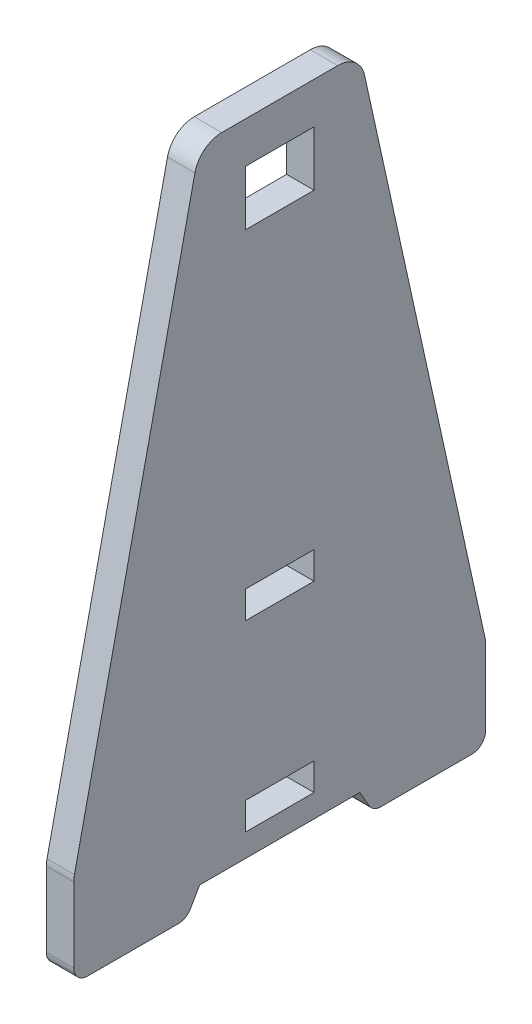
ISO-10303-21;
HEADER;
FILE_DESCRIPTION(('STEP AP214'),'2;1');
FILE_NAME('part.step','',(''),(''),'','','');
FILE_SCHEMA(('AUTOMOTIVE_DESIGN { 1 0 10303 214 1 1 1 1 }'));
ENDSEC;
DATA;
#1=APPLICATION_CONTEXT('core data for automotive mechanical design processes');
#2=APPLICATION_PROTOCOL_DEFINITION('international standard','automotive_design',2000,#1);
#3=PRODUCT_CONTEXT('',#1,'mechanical');
#4=PRODUCT('Part','Part','',(#3));
#5=PRODUCT_RELATED_PRODUCT_CATEGORY('part','',(#4));
#6=PRODUCT_DEFINITION_FORMATION('','',#4);
#7=PRODUCT_DEFINITION_CONTEXT('part definition',#1,'design');
#8=PRODUCT_DEFINITION('design','',#6,#7);
#9=PRODUCT_DEFINITION_SHAPE('','',#8);
#10=(LENGTH_UNIT() NAMED_UNIT(*) SI_UNIT(.MILLI.,.METRE.));
#11=(NAMED_UNIT(*) PLANE_ANGLE_UNIT() SI_UNIT($,.RADIAN.));
#12=(NAMED_UNIT(*) SI_UNIT($,.STERADIAN.) SOLID_ANGLE_UNIT());
#13=UNCERTAINTY_MEASURE_WITH_UNIT(LENGTH_MEASURE(1.E-05),#10,'distance_accuracy_value','');
#14=(GEOMETRIC_REPRESENTATION_CONTEXT(3) GLOBAL_UNCERTAINTY_ASSIGNED_CONTEXT((#13)) GLOBAL_UNIT_ASSIGNED_CONTEXT((#10,
#11,#12)) REPRESENTATION_CONTEXT('',''));
#15=CARTESIAN_POINT('',(0.,0.,0.));
#16=DIRECTION('',(0.,0.,1.));
#17=DIRECTION('',(1.,0.,0.));
#18=AXIS2_PLACEMENT_3D('',#15,#16,#17);
#19=CARTESIAN_POINT('',(6.,5.,17.5));
#20=DIRECTION('',(0.,0.499999999999998,0.86602540378444));
#21=DIRECTION('',(0.,-0.86602540378444,0.499999999999998));
#22=AXIS2_PLACEMENT_3D('',#19,#20,#21);
#23=PLANE('',#22);
#24=DIRECTION('',(0.,0.86602540378444,-0.499999999999997));
#25=VECTOR('',#24,1.);
#26=CARTESIAN_POINT('',(6.,5.,17.5));
#27=LINE('',#26,#25);
#28=CARTESIAN_POINT('',(6.,1.50000000000001,19.5207259421637));
#29=VERTEX_POINT('',#28);
#30=CARTESIAN_POINT('',(6.,5.,17.5));
#31=VERTEX_POINT('',#30);
#32=EDGE_CURVE('E339',#29,#31,#27,.T.);
#33=ORIENTED_EDGE('',*,*,#32,.F.);
#34=DIRECTION('',(-1.,0.,0.));
#35=VECTOR('',#34,1.);
#36=CARTESIAN_POINT('',(6.,1.5,19.5207259421637));
#37=LINE('',#36,#35);
#38=CARTESIAN_POINT('',(0.,1.50000000000001,19.5207259421637));
#39=VERTEX_POINT('',#38);
#40=EDGE_CURVE('E422',#29,#39,#37,.T.);
#41=ORIENTED_EDGE('',*,*,#40,.T.);
#42=DIRECTION('',(0.,0.86602540378444,-0.499999999999997));
#43=VECTOR('',#42,1.);
#44=CARTESIAN_POINT('',(0.,5.,17.5));
#45=LINE('',#44,#43);
#46=CARTESIAN_POINT('',(0.,5.,17.5));
#47=VERTEX_POINT('',#46);
#48=EDGE_CURVE('E272',#39,#47,#45,.T.);
#49=ORIENTED_EDGE('',*,*,#48,.T.);
#50=DIRECTION('',(-1.,0.,0.));
#51=VECTOR('',#50,1.);
#52=CARTESIAN_POINT('',(6.,5.,17.5));
#53=LINE('',#52,#51);
#54=EDGE_CURVE('E392',#31,#47,#53,.T.);
#55=ORIENTED_EDGE('',*,*,#54,.F.);
#56=EDGE_LOOP('',(#33,#41,#49,#55));
#57=FACE_BOUND('',#56,.T.);
#58=ADVANCED_FACE('F33',(#57),#23,.F.);
#59=CARTESIAN_POINT('',(6.,5.,-17.5));
#60=DIRECTION('',(0.,1.,0.));
#61=DIRECTION('',(0.,0.,1.));
#62=AXIS2_PLACEMENT_3D('',#59,#60,#61);
#63=PLANE('',#62);
#64=DIRECTION('',(0.,0.,-1.));
#65=VECTOR('',#64,1.);
#66=CARTESIAN_POINT('',(0.,5.,-17.5));
#67=LINE('',#66,#65);
#68=CARTESIAN_POINT('',(0.,5.,-17.5));
#69=VERTEX_POINT('',#68);
#70=EDGE_CURVE('E367',#47,#69,#67,.T.);
#71=ORIENTED_EDGE('',*,*,#70,.T.);
#72=DIRECTION('',(-1.,0.,0.));
#73=VECTOR('',#72,1.);
#74=CARTESIAN_POINT('',(6.,5.,-17.5));
#75=LINE('',#74,#73);
#76=CARTESIAN_POINT('',(6.,5.,-17.5));
#77=VERTEX_POINT('',#76);
#78=EDGE_CURVE('E365',#77,#69,#75,.T.);
#79=ORIENTED_EDGE('',*,*,#78,.F.);
#80=DIRECTION('',(0.,0.,-1.));
#81=VECTOR('',#80,1.);
#82=CARTESIAN_POINT('',(6.,5.,-17.5));
#83=LINE('',#82,#81);
#84=EDGE_CURVE('E341',#31,#77,#83,.T.);
#85=ORIENTED_EDGE('',*,*,#84,.F.);
#86=ORIENTED_EDGE('',*,*,#54,.T.);
#87=EDGE_LOOP('',(#71,#79,#85,#86));
#88=FACE_BOUND('',#87,.T.);
#89=ADVANCED_FACE('F514',(#88),#63,.F.);
#90=CARTESIAN_POINT('',(6.,5.,-17.5));
#91=DIRECTION('',(0.,0.499999999999998,-0.86602540378444));
#92=DIRECTION('',(0.,0.86602540378444,0.499999999999998));
#93=AXIS2_PLACEMENT_3D('',#90,#91,#92);
#94=PLANE('',#93);
#95=DIRECTION('',(0.,-0.86602540378444,-0.499999999999998));
#96=VECTOR('',#95,1.);
#97=CARTESIAN_POINT('',(0.,5.,-17.5));
#98=LINE('',#97,#96);
#99=CARTESIAN_POINT('',(0.,1.50000000000001,-19.5207259421637));
#100=VERTEX_POINT('',#99);
#101=EDGE_CURVE('E369',#69,#100,#98,.T.);
#102=ORIENTED_EDGE('',*,*,#101,.T.);
#103=DIRECTION('',(-1.,0.,0.));
#104=VECTOR('',#103,1.);
#105=CARTESIAN_POINT('',(6.,1.5,-19.5207259421637));
#106=LINE('',#105,#104);
#107=CARTESIAN_POINT('',(6.,1.50000000000001,-19.5207259421637));
#108=VERTEX_POINT('',#107);
#109=EDGE_CURVE('E420',#100,#108,#106,.F.);
#110=ORIENTED_EDGE('',*,*,#109,.T.);
#111=DIRECTION('',(0.,-0.86602540378444,-0.499999999999998));
#112=VECTOR('',#111,1.);
#113=CARTESIAN_POINT('',(6.,5.,-17.5));
#114=LINE('',#113,#112);
#115=EDGE_CURVE('E344',#77,#108,#114,.T.);
#116=ORIENTED_EDGE('',*,*,#115,.F.);
#117=ORIENTED_EDGE('',*,*,#78,.T.);
#118=EDGE_LOOP('',(#102,#110,#116,#117));
#119=FACE_BOUND('',#118,.T.);
#120=ADVANCED_FACE('F548',(#119),#94,.F.);
#121=CARTESIAN_POINT('',(6.,0.,-20.3867513459481));
#122=DIRECTION('',(0.,1.,0.));
#123=DIRECTION('',(0.,0.,1.));
#124=AXIS2_PLACEMENT_3D('',#121,#122,#123);
#125=PLANE('',#124);
#126=DIRECTION('',(0.,0.,-1.));
#127=VECTOR('',#126,1.);
#128=CARTESIAN_POINT('',(0.,0.,-20.3867513459481));
#129=LINE('',#128,#127);
#130=CARTESIAN_POINT('',(0.,0.,-22.118802153517));
#131=VERTEX_POINT('',#130);
#132=CARTESIAN_POINT('',(0.,0.,-42.));
#133=VERTEX_POINT('',#132);
#134=EDGE_CURVE('E372',#131,#133,#129,.T.);
#135=ORIENTED_EDGE('',*,*,#134,.T.);
#136=DIRECTION('',(-1.,0.,0.));
#137=VECTOR('',#136,1.);
#138=CARTESIAN_POINT('',(6.,0.,-42.));
#139=LINE('',#138,#137);
#140=CARTESIAN_POINT('',(6.,0.,-42.));
#141=VERTEX_POINT('',#140);
#142=EDGE_CURVE('E410',#133,#141,#139,.F.);
#143=ORIENTED_EDGE('',*,*,#142,.T.);
#144=DIRECTION('',(0.,0.,-1.));
#145=VECTOR('',#144,1.);
#146=CARTESIAN_POINT('',(6.,0.,-20.3867513459481));
#147=LINE('',#146,#145);
#148=CARTESIAN_POINT('',(6.,0.,-22.118802153517));
#149=VERTEX_POINT('',#148);
#150=EDGE_CURVE('E347',#149,#141,#147,.T.);
#151=ORIENTED_EDGE('',*,*,#150,.F.);
#152=DIRECTION('',(-1.,0.,0.));
#153=VECTOR('',#152,1.);
#154=CARTESIAN_POINT('',(6.,0.,-22.118802153517));
#155=LINE('',#154,#153);
#156=EDGE_CURVE('E407',#149,#131,#155,.T.);
#157=ORIENTED_EDGE('',*,*,#156,.T.);
#158=EDGE_LOOP('',(#135,#143,#151,#157));
#159=FACE_BOUND('',#158,.T.);
#160=ADVANCED_FACE('F526',(#159),#125,.F.);
#161=CARTESIAN_POINT('',(6.,0.,-45.));
#162=DIRECTION('',(0.,0.,1.));
#163=DIRECTION('',(0.,-1.,0.));
#164=AXIS2_PLACEMENT_3D('',#161,#162,#163);
#165=PLANE('',#164);
#166=DIRECTION('',(0.,1.,0.));
#167=VECTOR('',#166,1.);
#168=CARTESIAN_POINT('',(0.,0.,-45.));
#169=LINE('',#168,#167);
#170=CARTESIAN_POINT('',(0.,3.,-45.));
#171=VERTEX_POINT('',#170);
#172=CARTESIAN_POINT('',(0.,19.3477983938105,-45.));
#173=VERTEX_POINT('',#172);
#174=EDGE_CURVE('E375',#171,#173,#169,.T.);
#175=ORIENTED_EDGE('',*,*,#174,.T.);
#176=DIRECTION('',(-1.,0.,0.));
#177=VECTOR('',#176,1.);
#178=CARTESIAN_POINT('',(6.,19.3477983938105,-45.));
#179=LINE('',#178,#177);
#180=CARTESIAN_POINT('',(6.,19.3477983938105,-45.));
#181=VERTEX_POINT('',#180);
#182=EDGE_CURVE('E11',#173,#181,#179,.F.);
#183=ORIENTED_EDGE('',*,*,#182,.T.);
#184=DIRECTION('',(0.,1.,0.));
#185=VECTOR('',#184,1.);
#186=CARTESIAN_POINT('',(6.,0.,-45.));
#187=LINE('',#186,#185);
#188=CARTESIAN_POINT('',(6.,3.,-45.));
#189=VERTEX_POINT('',#188);
#190=EDGE_CURVE('E350',#189,#181,#187,.T.);
#191=ORIENTED_EDGE('',*,*,#190,.F.);
#192=DIRECTION('',(-1.,0.,0.));
#193=VECTOR('',#192,1.);
#194=CARTESIAN_POINT('',(6.,3.,-45.));
#195=LINE('',#194,#193);
#196=EDGE_CURVE('E395',#189,#171,#195,.T.);
#197=ORIENTED_EDGE('',*,*,#196,.T.);
#198=EDGE_LOOP('',(#175,#183,#191,#197));
#199=FACE_BOUND('',#198,.T.);
#200=ADVANCED_FACE('F536',(#199),#165,.F.);
#201=CARTESIAN_POINT('',(6.,20.,-45.));
#202=DIRECTION('',(0.,-0.21486178267512,0.97664446670509));
#203=DIRECTION('',(0.,-0.97664446670509,-0.21486178267512));
#204=AXIS2_PLACEMENT_3D('',#201,#202,#203);
#205=PLANE('',#204);
#206=DIRECTION('',(0.,0.97664446670509,0.21486178267512));
#207=VECTOR('',#206,1.);
#208=CARTESIAN_POINT('',(0.,20.,-45.));
#209=LINE('',#208,#207);
#210=CARTESIAN_POINT('',(0.,20.6369690898612,-44.8598668002305));
#211=VERTEX_POINT('',#210);
#212=CARTESIAN_POINT('',(0.,140.289170696051,-18.5363824468689));
#213=VERTEX_POINT('',#212);
#214=EDGE_CURVE('E378',#211,#213,#209,.T.);
#215=ORIENTED_EDGE('',*,*,#214,.T.);
#216=DIRECTION('',(-1.,0.,0.));
#217=VECTOR('',#216,1.);
#218=CARTESIAN_POINT('',(6.,140.289170696051,-18.5363824468688));
#219=LINE('',#218,#217);
#220=CARTESIAN_POINT('',(6.,140.289170696051,-18.5363824468689));
#221=VERTEX_POINT('',#220);
#222=EDGE_CURVE('E41',#213,#221,#219,.F.);
#223=ORIENTED_EDGE('',*,*,#222,.T.);
#224=DIRECTION('',(0.,0.97664446670509,0.21486178267512));
#225=VECTOR('',#224,1.);
#226=CARTESIAN_POINT('',(6.,20.,-45.));
#227=LINE('',#226,#225);
#228=CARTESIAN_POINT('',(6.,20.6369690898612,-44.8598668002305));
#229=VERTEX_POINT('',#228);
#230=EDGE_CURVE('E353',#229,#221,#227,.T.);
#231=ORIENTED_EDGE('',*,*,#230,.F.);
#232=DIRECTION('',(-1.,0.,0.));
#233=VECTOR('',#232,1.);
#234=CARTESIAN_POINT('',(6.,20.6369690898612,-44.8598668002305));
#235=LINE('',#234,#233);
#236=EDGE_CURVE('E460',#229,#211,#235,.T.);
#237=ORIENTED_EDGE('',*,*,#236,.T.);
#238=EDGE_LOOP('',(#215,#223,#231,#237));
#239=FACE_BOUND('',#238,.T.);
#240=ADVANCED_FACE('F465',(#239),#205,.F.);
#241=CARTESIAN_POINT('',(6.,145.,17.5));
#242=DIRECTION('',(0.,-1.,0.));
#243=DIRECTION('',(0.,0.,-1.));
#244=AXIS2_PLACEMENT_3D('',#241,#242,#243);
#245=PLANE('',#244);
#246=DIRECTION('',(0.,0.,1.));
#247=VECTOR('',#246,1.);
#248=CARTESIAN_POINT('',(0.,145.,17.5));
#249=LINE('',#248,#247);
#250=CARTESIAN_POINT('',(0.,145.,-12.6765156466383));
#251=VERTEX_POINT('',#250);
#252=CARTESIAN_POINT('',(0.,145.,12.6765156466383));
#253=VERTEX_POINT('',#252);
#254=EDGE_CURVE('E381',#251,#253,#249,.T.);
#255=ORIENTED_EDGE('',*,*,#254,.T.);
#256=DIRECTION('',(-1.,0.,0.));
#257=VECTOR('',#256,1.);
#258=CARTESIAN_POINT('',(6.,145.,12.6765156466383));
#259=LINE('',#258,#257);
#260=CARTESIAN_POINT('',(6.,145.,12.6765156466383));
#261=VERTEX_POINT('',#260);
#262=EDGE_CURVE('E48',#253,#261,#259,.F.);
#263=ORIENTED_EDGE('',*,*,#262,.T.);
#264=DIRECTION('',(0.,0.,1.));
#265=VECTOR('',#264,1.);
#266=CARTESIAN_POINT('',(6.,145.,17.5));
#267=LINE('',#266,#265);
#268=CARTESIAN_POINT('',(6.,145.,-12.6765156466383));
#269=VERTEX_POINT('',#268);
#270=EDGE_CURVE('E355',#269,#261,#267,.T.);
#271=ORIENTED_EDGE('',*,*,#270,.F.);
#272=DIRECTION('',(-1.,0.,0.));
#273=VECTOR('',#272,1.);
#274=CARTESIAN_POINT('',(6.,145.,-12.6765156466383));
#275=LINE('',#274,#273);
#276=EDGE_CURVE('E456',#269,#251,#275,.T.);
#277=ORIENTED_EDGE('',*,*,#276,.T.);
#278=EDGE_LOOP('',(#255,#263,#271,#277));
#279=FACE_BOUND('',#278,.T.);
#280=ADVANCED_FACE('F474',(#279),#245,.F.);
#281=CARTESIAN_POINT('',(6.,20.,45.));
#282=DIRECTION('',(0.,-0.21486178267512,-0.97664446670509));
#283=DIRECTION('',(0.,0.97664446670509,-0.21486178267512));
#284=AXIS2_PLACEMENT_3D('',#281,#282,#283);
#285=PLANE('',#284);
#286=DIRECTION('',(0.,-0.97664446670509,0.21486178267512));
#287=VECTOR('',#286,1.);
#288=CARTESIAN_POINT('',(0.,20.,45.));
#289=LINE('',#288,#287);
#290=CARTESIAN_POINT('',(0.,140.289170696051,18.5363824468689));
#291=VERTEX_POINT('',#290);
#292=CARTESIAN_POINT('',(0.,20.6369690898612,44.8598668002305));
#293=VERTEX_POINT('',#292);
#294=EDGE_CURVE('E383',#291,#293,#289,.T.);
#295=ORIENTED_EDGE('',*,*,#294,.T.);
#296=DIRECTION('',(-1.,0.,0.));
#297=VECTOR('',#296,1.);
#298=CARTESIAN_POINT('',(6.,20.6369690898612,44.8598668002305));
#299=LINE('',#298,#297);
#300=CARTESIAN_POINT('',(6.,20.6369690898612,44.8598668002305));
#301=VERTEX_POINT('',#300);
#302=EDGE_CURVE('E447',#293,#301,#299,.F.);
#303=ORIENTED_EDGE('',*,*,#302,.T.);
#304=DIRECTION('',(0.,-0.97664446670509,0.21486178267512));
#305=VECTOR('',#304,1.);
#306=CARTESIAN_POINT('',(6.,20.,45.));
#307=LINE('',#306,#305);
#308=CARTESIAN_POINT('',(6.,140.289170696051,18.5363824468689));
#309=VERTEX_POINT('',#308);
#310=EDGE_CURVE('E357',#309,#301,#307,.T.);
#311=ORIENTED_EDGE('',*,*,#310,.F.);
#312=DIRECTION('',(-1.,0.,0.));
#313=VECTOR('',#312,1.);
#314=CARTESIAN_POINT('',(6.,140.289170696051,18.5363824468688));
#315=LINE('',#314,#313);
#316=EDGE_CURVE('E444',#309,#291,#315,.T.);
#317=ORIENTED_EDGE('',*,*,#316,.T.);
#318=EDGE_LOOP('',(#295,#303,#311,#317));
#319=FACE_BOUND('',#318,.T.);
#320=ADVANCED_FACE('F484',(#319),#285,.F.);
#321=CARTESIAN_POINT('',(6.,0.,45.));
#322=DIRECTION('',(0.,0.,-1.));
#323=DIRECTION('',(0.,1.,0.));
#324=AXIS2_PLACEMENT_3D('',#321,#322,#323);
#325=PLANE('',#324);
#326=DIRECTION('',(0.,-1.,0.));
#327=VECTOR('',#326,1.);
#328=CARTESIAN_POINT('',(6.,0.,45.));
#329=LINE('',#328,#327);
#330=CARTESIAN_POINT('',(6.,19.3477983938105,45.));
#331=VERTEX_POINT('',#330);
#332=CARTESIAN_POINT('',(6.,3.,45.));
#333=VERTEX_POINT('',#332);
#334=EDGE_CURVE('E360',#331,#333,#329,.T.);
#335=ORIENTED_EDGE('',*,*,#334,.F.);
#336=DIRECTION('',(-1.,0.,0.));
#337=VECTOR('',#336,1.);
#338=CARTESIAN_POINT('',(6.,19.3477983938105,45.));
#339=LINE('',#338,#337);
#340=CARTESIAN_POINT('',(0.,19.3477983938105,45.));
#341=VERTEX_POINT('',#340);
#342=EDGE_CURVE('E433',#331,#341,#339,.T.);
#343=ORIENTED_EDGE('',*,*,#342,.T.);
#344=DIRECTION('',(0.,-1.,0.));
#345=VECTOR('',#344,1.);
#346=CARTESIAN_POINT('',(0.,0.,45.));
#347=LINE('',#346,#345);
#348=CARTESIAN_POINT('',(0.,3.,45.));
#349=VERTEX_POINT('',#348);
#350=EDGE_CURVE('E386',#341,#349,#347,.T.);
#351=ORIENTED_EDGE('',*,*,#350,.T.);
#352=DIRECTION('',(-1.,0.,0.));
#353=VECTOR('',#352,1.);
#354=CARTESIAN_POINT('',(6.,3.,45.));
#355=LINE('',#354,#353);
#356=EDGE_CURVE('E430',#349,#333,#355,.F.);
#357=ORIENTED_EDGE('',*,*,#356,.T.);
#358=EDGE_LOOP('',(#335,#343,#351,#357));
#359=FACE_BOUND('',#358,.T.);
#360=ADVANCED_FACE('F492',(#359),#325,.F.);
#361=CARTESIAN_POINT('',(6.,0.,20.3867513459481));
#362=DIRECTION('',(0.,1.,0.));
#363=DIRECTION('',(0.,0.,1.));
#364=AXIS2_PLACEMENT_3D('',#361,#362,#363);
#365=PLANE('',#364);
#366=DIRECTION('',(0.,0.,-1.));
#367=VECTOR('',#366,1.);
#368=CARTESIAN_POINT('',(0.,0.,20.3867513459481));
#369=LINE('',#368,#367);
#370=CARTESIAN_POINT('',(0.,0.,42.));
#371=VERTEX_POINT('',#370);
#372=CARTESIAN_POINT('',(0.,0.,22.118802153517));
#373=VERTEX_POINT('',#372);
#374=EDGE_CURVE('E342',#371,#373,#369,.T.);
#375=ORIENTED_EDGE('',*,*,#374,.T.);
#376=DIRECTION('',(-1.,0.,0.));
#377=VECTOR('',#376,1.);
#378=CARTESIAN_POINT('',(6.,0.,22.118802153517));
#379=LINE('',#378,#377);
#380=CARTESIAN_POINT('',(6.,0.,22.118802153517));
#381=VERTEX_POINT('',#380);
#382=EDGE_CURVE('E428',#373,#381,#379,.F.);
#383=ORIENTED_EDGE('',*,*,#382,.T.);
#384=DIRECTION('',(0.,0.,-1.));
#385=VECTOR('',#384,1.);
#386=CARTESIAN_POINT('',(6.,0.,20.3867513459481));
#387=LINE('',#386,#385);
#388=CARTESIAN_POINT('',(6.,0.,42.));
#389=VERTEX_POINT('',#388);
#390=EDGE_CURVE('E362',#389,#381,#387,.T.);
#391=ORIENTED_EDGE('',*,*,#390,.F.);
#392=DIRECTION('',(-1.,0.,0.));
#393=VECTOR('',#392,1.);
#394=CARTESIAN_POINT('',(6.,0.,42.));
#395=LINE('',#394,#393);
#396=EDGE_CURVE('E425',#389,#371,#395,.T.);
#397=ORIENTED_EDGE('',*,*,#396,.T.);
#398=EDGE_LOOP('',(#375,#383,#391,#397));
#399=FACE_BOUND('',#398,.T.);
#400=ADVANCED_FACE('F502',(#399),#365,.F.);
#401=CARTESIAN_POINT('',(6.,0.,0.));
#402=DIRECTION('',(-1.,0.,0.));
#403=DIRECTION('',(0.,0.,1.));
#404=AXIS2_PLACEMENT_3D('',#401,#402,#403);
#405=PLANE('',#404);
#406=DIRECTION('',(0.,0.,-1.));
#407=VECTOR('',#406,1.);
#408=CARTESIAN_POINT('',(6.,124.,-7.49999999999997));
#409=LINE('',#408,#407);
#410=CARTESIAN_POINT('',(6.,124.,7.50000000000002));
#411=VERTEX_POINT('',#410);
#412=CARTESIAN_POINT('',(6.,124.,-7.49999999999997));
#413=VERTEX_POINT('',#412);
#414=EDGE_CURVE('E265',#411,#413,#409,.T.);
#415=ORIENTED_EDGE('',*,*,#414,.F.);
#416=DIRECTION('',(0.,-1.,0.));
#417=VECTOR('',#416,1.);
#418=CARTESIAN_POINT('',(6.,136.,7.50000000000003));
#419=LINE('',#418,#417);
#420=CARTESIAN_POINT('',(6.,136.,7.50000000000003));
#421=VERTEX_POINT('',#420);
#422=EDGE_CURVE('E238',#421,#411,#419,.T.);
#423=ORIENTED_EDGE('',*,*,#422,.F.);
#424=DIRECTION('',(0.,0.,1.));
#425=VECTOR('',#424,1.);
#426=CARTESIAN_POINT('',(6.,136.,-7.49999999999997));
#427=LINE('',#426,#425);
#428=CARTESIAN_POINT('',(6.,136.,-7.49999999999997));
#429=VERTEX_POINT('',#428);
#430=EDGE_CURVE('E256',#429,#421,#427,.T.);
#431=ORIENTED_EDGE('',*,*,#430,.F.);
#432=DIRECTION('',(0.,1.,0.));
#433=VECTOR('',#432,1.);
#434=CARTESIAN_POINT('',(6.,136.,-7.49999999999997));
#435=LINE('',#434,#433);
#436=EDGE_CURVE('E259',#413,#429,#435,.T.);
#437=ORIENTED_EDGE('',*,*,#436,.F.);
#438=EDGE_LOOP('',(#415,#423,#431,#437));
#439=FACE_BOUND('',#438,.T.);
#440=DIRECTION('',(0.,0.,-1.));
#441=VECTOR('',#440,1.);
#442=CARTESIAN_POINT('',(6.,50.,-7.5));
#443=LINE('',#442,#441);
#444=CARTESIAN_POINT('',(6.,50.,7.5));
#445=VERTEX_POINT('',#444);
#446=CARTESIAN_POINT('',(6.,50.,-7.5));
#447=VERTEX_POINT('',#446);
#448=EDGE_CURVE('E292',#445,#447,#443,.T.);
#449=ORIENTED_EDGE('',*,*,#448,.F.);
#450=DIRECTION('',(0.,-1.,0.));
#451=VECTOR('',#450,1.);
#452=CARTESIAN_POINT('',(6.,56.,7.5));
#453=LINE('',#452,#451);
#454=CARTESIAN_POINT('',(6.,56.,7.5));
#455=VERTEX_POINT('',#454);
#456=EDGE_CURVE('E290',#455,#445,#453,.T.);
#457=ORIENTED_EDGE('',*,*,#456,.F.);
#458=DIRECTION('',(0.,0.,1.));
#459=VECTOR('',#458,1.);
#460=CARTESIAN_POINT('',(6.,56.,-7.5));
#461=LINE('',#460,#459);
#462=CARTESIAN_POINT('',(6.,56.,-7.5));
#463=VERTEX_POINT('',#462);
#464=EDGE_CURVE('E280',#463,#455,#461,.T.);
#465=ORIENTED_EDGE('',*,*,#464,.F.);
#466=DIRECTION('',(0.,1.,0.));
#467=VECTOR('',#466,1.);
#468=CARTESIAN_POINT('',(6.,56.,-7.5));
#469=LINE('',#468,#467);
#470=EDGE_CURVE('E296',#447,#463,#469,.T.);
#471=ORIENTED_EDGE('',*,*,#470,.F.);
#472=EDGE_LOOP('',(#449,#457,#465,#471));
#473=FACE_BOUND('',#472,.T.);
#474=DIRECTION('',(0.,0.,-1.));
#475=VECTOR('',#474,1.);
#476=CARTESIAN_POINT('',(6.,10.,-7.5));
#477=LINE('',#476,#475);
#478=CARTESIAN_POINT('',(6.,10.,7.5));
#479=VERTEX_POINT('',#478);
#480=CARTESIAN_POINT('',(6.,10.,-7.5));
#481=VERTEX_POINT('',#480);
#482=EDGE_CURVE('E324',#479,#481,#477,.T.);
#483=ORIENTED_EDGE('',*,*,#482,.F.);
#484=DIRECTION('',(0.,-1.,0.));
#485=VECTOR('',#484,1.);
#486=CARTESIAN_POINT('',(6.,16.,7.5));
#487=LINE('',#486,#485);
#488=CARTESIAN_POINT('',(6.,16.,7.5));
#489=VERTEX_POINT('',#488);
#490=EDGE_CURVE('E322',#489,#479,#487,.T.);
#491=ORIENTED_EDGE('',*,*,#490,.F.);
#492=DIRECTION('',(0.,0.,1.));
#493=VECTOR('',#492,1.);
#494=CARTESIAN_POINT('',(6.,16.,-7.5));
#495=LINE('',#494,#493);
#496=CARTESIAN_POINT('',(6.,16.,-7.5));
#497=VERTEX_POINT('',#496);
#498=EDGE_CURVE('E312',#497,#489,#495,.T.);
#499=ORIENTED_EDGE('',*,*,#498,.F.);
#500=DIRECTION('',(0.,1.,0.));
#501=VECTOR('',#500,1.);
#502=CARTESIAN_POINT('',(6.,16.,-7.5));
#503=LINE('',#502,#501);
#504=EDGE_CURVE('E327',#481,#497,#503,.T.);
#505=ORIENTED_EDGE('',*,*,#504,.F.);
#506=EDGE_LOOP('',(#483,#491,#499,#505));
#507=FACE_BOUND('',#506,.T.);
#508=ORIENTED_EDGE('',*,*,#310,.T.);
#509=CARTESIAN_POINT('',(6.,19.3477983938105,39.));
#510=DIRECTION('',(-1.,0.,0.));
#511=DIRECTION('',(0.,0.,1.));
#512=AXIS2_PLACEMENT_3D('',#509,#510,#511);
#513=CIRCLE('',#512,6.);
#514=EDGE_CURVE('E454',#301,#331,#513,.F.);
#515=ORIENTED_EDGE('',*,*,#514,.T.);
#516=ORIENTED_EDGE('',*,*,#334,.T.);
#517=CARTESIAN_POINT('',(6.,3.,42.));
#518=DIRECTION('',(-1.,0.,0.));
#519=DIRECTION('',(0.,0.,1.));
#520=AXIS2_PLACEMENT_3D('',#517,#518,#519);
#521=CIRCLE('',#520,3.);
#522=EDGE_CURVE('E412',#333,#389,#521,.F.);
#523=ORIENTED_EDGE('',*,*,#522,.T.);
#524=ORIENTED_EDGE('',*,*,#390,.T.);
#525=CARTESIAN_POINT('',(6.,3.,22.118802153517));
#526=DIRECTION('',(-1.,0.,0.));
#527=DIRECTION('',(0.,0.,1.));
#528=AXIS2_PLACEMENT_3D('',#525,#526,#527);
#529=CIRCLE('',#528,3.);
#530=EDGE_CURVE('E414',#381,#29,#529,.F.);
#531=ORIENTED_EDGE('',*,*,#530,.T.);
#532=ORIENTED_EDGE('',*,*,#32,.T.);
#533=ORIENTED_EDGE('',*,*,#84,.T.);
#534=ORIENTED_EDGE('',*,*,#115,.T.);
#535=CARTESIAN_POINT('',(6.,3.,-22.118802153517));
#536=DIRECTION('',(-1.,0.,0.));
#537=DIRECTION('',(0.,0.,1.));
#538=AXIS2_PLACEMENT_3D('',#535,#536,#537);
#539=CIRCLE('',#538,3.);
#540=EDGE_CURVE('E416',#108,#149,#539,.F.);
#541=ORIENTED_EDGE('',*,*,#540,.T.);
#542=ORIENTED_EDGE('',*,*,#150,.T.);
#543=CARTESIAN_POINT('',(6.,3.,-42.));
#544=DIRECTION('',(-1.,0.,0.));
#545=DIRECTION('',(0.,0.,1.));
#546=AXIS2_PLACEMENT_3D('',#543,#544,#545);
#547=CIRCLE('',#546,3.);
#548=EDGE_CURVE('E418',#141,#189,#547,.F.);
#549=ORIENTED_EDGE('',*,*,#548,.T.);
#550=ORIENTED_EDGE('',*,*,#190,.T.);
#551=CARTESIAN_POINT('',(6.,19.3477983938105,-39.));
#552=DIRECTION('',(-1.,0.,0.));
#553=DIRECTION('',(0.,0.,1.));
#554=AXIS2_PLACEMENT_3D('',#551,#552,#553);
#555=CIRCLE('',#554,6.);
#556=EDGE_CURVE('E449',#181,#229,#555,.F.);
#557=ORIENTED_EDGE('',*,*,#556,.T.);
#558=ORIENTED_EDGE('',*,*,#230,.T.);
#559=CARTESIAN_POINT('',(6.,139.,-12.6765156466383));
#560=DIRECTION('',(-1.,0.,0.));
#561=DIRECTION('',(0.,0.,1.));
#562=AXIS2_PLACEMENT_3D('',#559,#560,#561);
#563=CIRCLE('',#562,6.);
#564=EDGE_CURVE('E55',#221,#269,#563,.F.);
#565=ORIENTED_EDGE('',*,*,#564,.T.);
#566=ORIENTED_EDGE('',*,*,#270,.T.);
#567=CARTESIAN_POINT('',(6.,139.,12.6765156466383));
#568=DIRECTION('',(-1.,0.,0.));
#569=DIRECTION('',(0.,0.,1.));
#570=AXIS2_PLACEMENT_3D('',#567,#568,#569);
#571=CIRCLE('',#570,6.);
#572=EDGE_CURVE('E452',#261,#309,#571,.F.);
#573=ORIENTED_EDGE('',*,*,#572,.T.);
#574=EDGE_LOOP('',(#508,#515,#516,#523,#524,#531,#532,#533,#534,#541,#542,#549,#550,#557,#558,
#565,#566,#573));
#575=FACE_BOUND('',#574,.T.);
#576=ADVANCED_FACE('F469',(#439,#473,#507,#575),#405,.F.);
#577=CARTESIAN_POINT('',(0.,0.,0.));
#578=DIRECTION('',(-1.,0.,0.));
#579=DIRECTION('',(0.,0.,1.));
#580=AXIS2_PLACEMENT_3D('',#577,#578,#579);
#581=PLANE('',#580);
#582=DIRECTION('',(0.,-1.,0.));
#583=VECTOR('',#582,1.);
#584=CARTESIAN_POINT('',(0.,136.,7.50000000000003));
#585=LINE('',#584,#583);
#586=CARTESIAN_POINT('',(0.,136.,7.50000000000003));
#587=VERTEX_POINT('',#586);
#588=CARTESIAN_POINT('',(0.,124.,7.50000000000002));
#589=VERTEX_POINT('',#588);
#590=EDGE_CURVE('E235',#587,#589,#585,.T.);
#591=ORIENTED_EDGE('',*,*,#590,.T.);
#592=DIRECTION('',(0.,0.,-1.));
#593=VECTOR('',#592,1.);
#594=CARTESIAN_POINT('',(0.,124.,-7.49999999999997));
#595=LINE('',#594,#593);
#596=CARTESIAN_POINT('',(0.,124.,-7.49999999999997));
#597=VERTEX_POINT('',#596);
#598=EDGE_CURVE('E247',#589,#597,#595,.T.);
#599=ORIENTED_EDGE('',*,*,#598,.T.);
#600=DIRECTION('',(0.,1.,0.));
#601=VECTOR('',#600,1.);
#602=CARTESIAN_POINT('',(0.,136.,-7.49999999999997));
#603=LINE('',#602,#601);
#604=CARTESIAN_POINT('',(0.,136.,-7.49999999999997));
#605=VERTEX_POINT('',#604);
#606=EDGE_CURVE('E251',#597,#605,#603,.T.);
#607=ORIENTED_EDGE('',*,*,#606,.T.);
#608=DIRECTION('',(0.,0.,1.));
#609=VECTOR('',#608,1.);
#610=CARTESIAN_POINT('',(0.,136.,-7.49999999999997));
#611=LINE('',#610,#609);
#612=EDGE_CURVE('E243',#605,#587,#611,.T.);
#613=ORIENTED_EDGE('',*,*,#612,.T.);
#614=EDGE_LOOP('',(#591,#599,#607,#613));
#615=FACE_BOUND('',#614,.T.);
#616=DIRECTION('',(0.,-1.,0.));
#617=VECTOR('',#616,1.);
#618=CARTESIAN_POINT('',(0.,56.,7.5));
#619=LINE('',#618,#617);
#620=CARTESIAN_POINT('',(0.,56.,7.5));
#621=VERTEX_POINT('',#620);
#622=CARTESIAN_POINT('',(0.,50.,7.5));
#623=VERTEX_POINT('',#622);
#624=EDGE_CURVE('E276',#621,#623,#619,.T.);
#625=ORIENTED_EDGE('',*,*,#624,.T.);
#626=DIRECTION('',(0.,0.,-1.));
#627=VECTOR('',#626,1.);
#628=CARTESIAN_POINT('',(0.,50.,-7.5));
#629=LINE('',#628,#627);
#630=CARTESIAN_POINT('',(0.,50.,-7.5));
#631=VERTEX_POINT('',#630);
#632=EDGE_CURVE('E279',#623,#631,#629,.T.);
#633=ORIENTED_EDGE('',*,*,#632,.T.);
#634=DIRECTION('',(0.,1.,0.));
#635=VECTOR('',#634,1.);
#636=CARTESIAN_POINT('',(0.,56.,-7.5));
#637=LINE('',#636,#635);
#638=CARTESIAN_POINT('',(0.,56.,-7.5));
#639=VERTEX_POINT('',#638);
#640=EDGE_CURVE('E283',#631,#639,#637,.T.);
#641=ORIENTED_EDGE('',*,*,#640,.T.);
#642=DIRECTION('',(0.,0.,1.));
#643=VECTOR('',#642,1.);
#644=CARTESIAN_POINT('',(0.,56.,-7.5));
#645=LINE('',#644,#643);
#646=EDGE_CURVE('E286',#639,#621,#645,.T.);
#647=ORIENTED_EDGE('',*,*,#646,.T.);
#648=EDGE_LOOP('',(#625,#633,#641,#647));
#649=FACE_BOUND('',#648,.T.);
#650=DIRECTION('',(0.,-1.,0.));
#651=VECTOR('',#650,1.);
#652=CARTESIAN_POINT('',(0.,16.,7.5));
#653=LINE('',#652,#651);
#654=CARTESIAN_POINT('',(0.,16.,7.5));
#655=VERTEX_POINT('',#654);
#656=CARTESIAN_POINT('',(0.,10.,7.5));
#657=VERTEX_POINT('',#656);
#658=EDGE_CURVE('E308',#655,#657,#653,.T.);
#659=ORIENTED_EDGE('',*,*,#658,.T.);
#660=DIRECTION('',(0.,0.,-1.));
#661=VECTOR('',#660,1.);
#662=CARTESIAN_POINT('',(0.,10.,-7.5));
#663=LINE('',#662,#661);
#664=CARTESIAN_POINT('',(0.,10.,-7.5));
#665=VERTEX_POINT('',#664);
#666=EDGE_CURVE('E311',#657,#665,#663,.T.);
#667=ORIENTED_EDGE('',*,*,#666,.T.);
#668=DIRECTION('',(0.,1.,0.));
#669=VECTOR('',#668,1.);
#670=CARTESIAN_POINT('',(0.,16.,-7.5));
#671=LINE('',#670,#669);
#672=CARTESIAN_POINT('',(0.,16.,-7.5));
#673=VERTEX_POINT('',#672);
#674=EDGE_CURVE('E315',#665,#673,#671,.T.);
#675=ORIENTED_EDGE('',*,*,#674,.T.);
#676=DIRECTION('',(0.,0.,1.));
#677=VECTOR('',#676,1.);
#678=CARTESIAN_POINT('',(0.,16.,-7.5));
#679=LINE('',#678,#677);
#680=EDGE_CURVE('E318',#673,#655,#679,.T.);
#681=ORIENTED_EDGE('',*,*,#680,.T.);
#682=EDGE_LOOP('',(#659,#667,#675,#681));
#683=FACE_BOUND('',#682,.T.);
#684=ORIENTED_EDGE('',*,*,#350,.F.);
#685=CARTESIAN_POINT('',(0.,19.3477983938105,39.));
#686=DIRECTION('',(-1.,0.,0.));
#687=DIRECTION('',(0.,0.,1.));
#688=AXIS2_PLACEMENT_3D('',#685,#686,#687);
#689=CIRCLE('',#688,6.);
#690=EDGE_CURVE('E442',#341,#293,#689,.T.);
#691=ORIENTED_EDGE('',*,*,#690,.T.);
#692=ORIENTED_EDGE('',*,*,#294,.F.);
#693=CARTESIAN_POINT('',(0.,139.,12.6765156466383));
#694=DIRECTION('',(-1.,0.,0.));
#695=DIRECTION('',(0.,0.,1.));
#696=AXIS2_PLACEMENT_3D('',#693,#694,#695);
#697=CIRCLE('',#696,6.);
#698=EDGE_CURVE('E440',#291,#253,#697,.T.);
#699=ORIENTED_EDGE('',*,*,#698,.T.);
#700=ORIENTED_EDGE('',*,*,#254,.F.);
#701=CARTESIAN_POINT('',(0.,139.,-12.6765156466383));
#702=DIRECTION('',(-1.,0.,0.));
#703=DIRECTION('',(0.,0.,1.));
#704=AXIS2_PLACEMENT_3D('',#701,#702,#703);
#705=CIRCLE('',#704,6.);
#706=EDGE_CURVE('E438',#251,#213,#705,.T.);
#707=ORIENTED_EDGE('',*,*,#706,.T.);
#708=ORIENTED_EDGE('',*,*,#214,.F.);
#709=CARTESIAN_POINT('',(0.,19.3477983938105,-39.));
#710=DIRECTION('',(-1.,0.,0.));
#711=DIRECTION('',(0.,0.,1.));
#712=AXIS2_PLACEMENT_3D('',#709,#710,#711);
#713=CIRCLE('',#712,6.);
#714=EDGE_CURVE('E436',#211,#173,#713,.T.);
#715=ORIENTED_EDGE('',*,*,#714,.T.);
#716=ORIENTED_EDGE('',*,*,#174,.F.);
#717=CARTESIAN_POINT('',(0.,3.,-42.));
#718=DIRECTION('',(-1.,0.,0.));
#719=DIRECTION('',(0.,0.,1.));
#720=AXIS2_PLACEMENT_3D('',#717,#718,#719);
#721=CIRCLE('',#720,3.);
#722=EDGE_CURVE('E405',#171,#133,#721,.T.);
#723=ORIENTED_EDGE('',*,*,#722,.T.);
#724=ORIENTED_EDGE('',*,*,#134,.F.);
#725=CARTESIAN_POINT('',(0.,3.,-22.118802153517));
#726=DIRECTION('',(-1.,0.,0.));
#727=DIRECTION('',(0.,0.,1.));
#728=AXIS2_PLACEMENT_3D('',#725,#726,#727);
#729=CIRCLE('',#728,3.);
#730=EDGE_CURVE('E403',#131,#100,#729,.T.);
#731=ORIENTED_EDGE('',*,*,#730,.T.);
#732=ORIENTED_EDGE('',*,*,#101,.F.);
#733=ORIENTED_EDGE('',*,*,#70,.F.);
#734=ORIENTED_EDGE('',*,*,#48,.F.);
#735=CARTESIAN_POINT('',(0.,3.,22.118802153517));
#736=DIRECTION('',(-1.,0.,0.));
#737=DIRECTION('',(0.,0.,1.));
#738=AXIS2_PLACEMENT_3D('',#735,#736,#737);
#739=CIRCLE('',#738,3.);
#740=EDGE_CURVE('E401',#39,#373,#739,.T.);
#741=ORIENTED_EDGE('',*,*,#740,.T.);
#742=ORIENTED_EDGE('',*,*,#374,.F.);
#743=CARTESIAN_POINT('',(0.,3.,42.));
#744=DIRECTION('',(-1.,0.,0.));
#745=DIRECTION('',(0.,0.,1.));
#746=AXIS2_PLACEMENT_3D('',#743,#744,#745);
#747=CIRCLE('',#746,3.);
#748=EDGE_CURVE('E398',#371,#349,#747,.T.);
#749=ORIENTED_EDGE('',*,*,#748,.T.);
#750=EDGE_LOOP('',(#684,#691,#692,#699,#700,#707,#708,#715,#716,#723,#724,#731,#732,#733,#734,
#741,#742,#749));
#751=FACE_BOUND('',#750,.T.);
#752=ADVANCED_FACE('F253',(#615,#649,#683,#751),#581,.T.);
#753=CARTESIAN_POINT('',(0.,16.,7.5));
#754=DIRECTION('',(0.,0.,1.));
#755=DIRECTION('',(0.,-1.,0.));
#756=AXIS2_PLACEMENT_3D('',#753,#754,#755);
#757=PLANE('',#756);
#758=ORIENTED_EDGE('',*,*,#490,.T.);
#759=DIRECTION('',(1.,0.,0.));
#760=VECTOR('',#759,1.);
#761=CARTESIAN_POINT('',(0.,10.,7.5));
#762=LINE('',#761,#760);
#763=EDGE_CURVE('E321',#657,#479,#762,.T.);
#764=ORIENTED_EDGE('',*,*,#763,.F.);
#765=ORIENTED_EDGE('',*,*,#658,.F.);
#766=DIRECTION('',(1.,0.,0.));
#767=VECTOR('',#766,1.);
#768=CARTESIAN_POINT('',(0.,16.,7.5));
#769=LINE('',#768,#767);
#770=EDGE_CURVE('E293',#655,#489,#769,.T.);
#771=ORIENTED_EDGE('',*,*,#770,.T.);
#772=EDGE_LOOP('',(#758,#764,#765,#771));
#773=FACE_BOUND('',#772,.T.);
#774=ADVANCED_FACE('F701',(#773),#757,.F.);
#775=CARTESIAN_POINT('',(0.,16.,-7.5));
#776=DIRECTION('',(0.,1.,0.));
#777=DIRECTION('',(0.,0.,1.));
#778=AXIS2_PLACEMENT_3D('',#775,#776,#777);
#779=PLANE('',#778);
#780=ORIENTED_EDGE('',*,*,#498,.T.);
#781=ORIENTED_EDGE('',*,*,#770,.F.);
#782=ORIENTED_EDGE('',*,*,#680,.F.);
#783=DIRECTION('',(1.,0.,0.));
#784=VECTOR('',#783,1.);
#785=CARTESIAN_POINT('',(0.,16.,-7.5));
#786=LINE('',#785,#784);
#787=EDGE_CURVE('E333',#673,#497,#786,.T.);
#788=ORIENTED_EDGE('',*,*,#787,.T.);
#789=EDGE_LOOP('',(#780,#781,#782,#788));
#790=FACE_BOUND('',#789,.T.);
#791=ADVANCED_FACE('F692',(#790),#779,.F.);
#792=CARTESIAN_POINT('',(0.,16.,-7.5));
#793=DIRECTION('',(0.,0.,-1.));
#794=DIRECTION('',(0.,1.,0.));
#795=AXIS2_PLACEMENT_3D('',#792,#793,#794);
#796=PLANE('',#795);
#797=ORIENTED_EDGE('',*,*,#504,.T.);
#798=ORIENTED_EDGE('',*,*,#787,.F.);
#799=ORIENTED_EDGE('',*,*,#674,.F.);
#800=DIRECTION('',(1.,0.,0.));
#801=VECTOR('',#800,1.);
#802=CARTESIAN_POINT('',(0.,10.,-7.5));
#803=LINE('',#802,#801);
#804=EDGE_CURVE('E335',#665,#481,#803,.T.);
#805=ORIENTED_EDGE('',*,*,#804,.T.);
#806=EDGE_LOOP('',(#797,#798,#799,#805));
#807=FACE_BOUND('',#806,.T.);
#808=ADVANCED_FACE('F683',(#807),#796,.F.);
#809=CARTESIAN_POINT('',(0.,10.,-7.5));
#810=DIRECTION('',(0.,-1.,0.));
#811=DIRECTION('',(0.,0.,-1.));
#812=AXIS2_PLACEMENT_3D('',#809,#810,#811);
#813=PLANE('',#812);
#814=ORIENTED_EDGE('',*,*,#482,.T.);
#815=ORIENTED_EDGE('',*,*,#804,.F.);
#816=ORIENTED_EDGE('',*,*,#666,.F.);
#817=ORIENTED_EDGE('',*,*,#763,.T.);
#818=EDGE_LOOP('',(#814,#815,#816,#817));
#819=FACE_BOUND('',#818,.T.);
#820=ADVANCED_FACE('F674',(#819),#813,.F.);
#821=CARTESIAN_POINT('',(0.,56.,7.5));
#822=DIRECTION('',(0.,0.,1.));
#823=DIRECTION('',(0.,-1.,0.));
#824=AXIS2_PLACEMENT_3D('',#821,#822,#823);
#825=PLANE('',#824);
#826=ORIENTED_EDGE('',*,*,#456,.T.);
#827=DIRECTION('',(1.,0.,0.));
#828=VECTOR('',#827,1.);
#829=CARTESIAN_POINT('',(0.,50.,7.5));
#830=LINE('',#829,#828);
#831=EDGE_CURVE('E289',#623,#445,#830,.T.);
#832=ORIENTED_EDGE('',*,*,#831,.F.);
#833=ORIENTED_EDGE('',*,*,#624,.F.);
#834=DIRECTION('',(1.,0.,0.));
#835=VECTOR('',#834,1.);
#836=CARTESIAN_POINT('',(0.,56.,7.5));
#837=LINE('',#836,#835);
#838=EDGE_CURVE('E266',#621,#455,#837,.T.);
#839=ORIENTED_EDGE('',*,*,#838,.T.);
#840=EDGE_LOOP('',(#826,#832,#833,#839));
#841=FACE_BOUND('',#840,.T.);
#842=ADVANCED_FACE('F665',(#841),#825,.F.);
#843=CARTESIAN_POINT('',(0.,56.,-7.5));
#844=DIRECTION('',(0.,1.,0.));
#845=DIRECTION('',(0.,0.,1.));
#846=AXIS2_PLACEMENT_3D('',#843,#844,#845);
#847=PLANE('',#846);
#848=ORIENTED_EDGE('',*,*,#464,.T.);
#849=ORIENTED_EDGE('',*,*,#838,.F.);
#850=ORIENTED_EDGE('',*,*,#646,.F.);
#851=DIRECTION('',(1.,0.,0.));
#852=VECTOR('',#851,1.);
#853=CARTESIAN_POINT('',(0.,56.,-7.5));
#854=LINE('',#853,#852);
#855=EDGE_CURVE('E302',#639,#463,#854,.T.);
#856=ORIENTED_EDGE('',*,*,#855,.T.);
#857=EDGE_LOOP('',(#848,#849,#850,#856));
#858=FACE_BOUND('',#857,.T.);
#859=ADVANCED_FACE('F656',(#858),#847,.F.);
#860=CARTESIAN_POINT('',(0.,56.,-7.5));
#861=DIRECTION('',(0.,0.,-1.));
#862=DIRECTION('',(0.,1.,0.));
#863=AXIS2_PLACEMENT_3D('',#860,#861,#862);
#864=PLANE('',#863);
#865=ORIENTED_EDGE('',*,*,#470,.T.);
#866=ORIENTED_EDGE('',*,*,#855,.F.);
#867=ORIENTED_EDGE('',*,*,#640,.F.);
#868=DIRECTION('',(1.,0.,0.));
#869=VECTOR('',#868,1.);
#870=CARTESIAN_POINT('',(0.,50.,-7.5));
#871=LINE('',#870,#869);
#872=EDGE_CURVE('E304',#631,#447,#871,.T.);
#873=ORIENTED_EDGE('',*,*,#872,.T.);
#874=EDGE_LOOP('',(#865,#866,#867,#873));
#875=FACE_BOUND('',#874,.T.);
#876=ADVANCED_FACE('F647',(#875),#864,.F.);
#877=CARTESIAN_POINT('',(0.,50.,-7.5));
#878=DIRECTION('',(0.,-1.,0.));
#879=DIRECTION('',(0.,0.,-1.));
#880=AXIS2_PLACEMENT_3D('',#877,#878,#879);
#881=PLANE('',#880);
#882=ORIENTED_EDGE('',*,*,#448,.T.);
#883=ORIENTED_EDGE('',*,*,#872,.F.);
#884=ORIENTED_EDGE('',*,*,#632,.F.);
#885=ORIENTED_EDGE('',*,*,#831,.T.);
#886=EDGE_LOOP('',(#882,#883,#884,#885));
#887=FACE_BOUND('',#886,.T.);
#888=ADVANCED_FACE('F639',(#887),#881,.F.);
#889=CARTESIAN_POINT('',(0.,136.,7.50000000000003));
#890=DIRECTION('',(0.,0.,1.));
#891=DIRECTION('',(0.,-1.,0.));
#892=AXIS2_PLACEMENT_3D('',#889,#890,#891);
#893=PLANE('',#892);
#894=ORIENTED_EDGE('',*,*,#422,.T.);
#895=DIRECTION('',(1.,0.,0.));
#896=VECTOR('',#895,1.);
#897=CARTESIAN_POINT('',(0.,124.,7.50000000000002));
#898=LINE('',#897,#896);
#899=EDGE_CURVE('E231',#589,#411,#898,.T.);
#900=ORIENTED_EDGE('',*,*,#899,.F.);
#901=ORIENTED_EDGE('',*,*,#590,.F.);
#902=DIRECTION('',(1.,0.,0.));
#903=VECTOR('',#902,1.);
#904=CARTESIAN_POINT('',(0.,136.,7.50000000000003));
#905=LINE('',#904,#903);
#906=EDGE_CURVE('E270',#587,#421,#905,.T.);
#907=ORIENTED_EDGE('',*,*,#906,.T.);
#908=EDGE_LOOP('',(#894,#900,#901,#907));
#909=FACE_BOUND('',#908,.T.);
#910=ADVANCED_FACE('F233',(#909),#893,.F.);
#911=CARTESIAN_POINT('',(0.,136.,-7.49999999999997));
#912=DIRECTION('',(0.,1.,0.));
#913=DIRECTION('',(0.,0.,1.));
#914=AXIS2_PLACEMENT_3D('',#911,#912,#913);
#915=PLANE('',#914);
#916=ORIENTED_EDGE('',*,*,#430,.T.);
#917=ORIENTED_EDGE('',*,*,#906,.F.);
#918=ORIENTED_EDGE('',*,*,#612,.F.);
#919=DIRECTION('',(1.,0.,0.));
#920=VECTOR('',#919,1.);
#921=CARTESIAN_POINT('',(0.,136.,-7.49999999999997));
#922=LINE('',#921,#920);
#923=EDGE_CURVE('E273',#605,#429,#922,.T.);
#924=ORIENTED_EDGE('',*,*,#923,.T.);
#925=EDGE_LOOP('',(#916,#917,#918,#924));
#926=FACE_BOUND('',#925,.T.);
#927=ADVANCED_FACE('F622',(#926),#915,.F.);
#928=CARTESIAN_POINT('',(0.,136.,-7.49999999999997));
#929=DIRECTION('',(0.,0.,-1.));
#930=DIRECTION('',(0.,1.,0.));
#931=AXIS2_PLACEMENT_3D('',#928,#929,#930);
#932=PLANE('',#931);
#933=ORIENTED_EDGE('',*,*,#436,.T.);
#934=ORIENTED_EDGE('',*,*,#923,.F.);
#935=ORIENTED_EDGE('',*,*,#606,.F.);
#936=DIRECTION('',(1.,0.,0.));
#937=VECTOR('',#936,1.);
#938=CARTESIAN_POINT('',(0.,124.,-7.49999999999997));
#939=LINE('',#938,#937);
#940=EDGE_CURVE('E242',#597,#413,#939,.T.);
#941=ORIENTED_EDGE('',*,*,#940,.T.);
#942=EDGE_LOOP('',(#933,#934,#935,#941));
#943=FACE_BOUND('',#942,.T.);
#944=ADVANCED_FACE('F614',(#943),#932,.F.);
#945=CARTESIAN_POINT('',(0.,124.,-7.49999999999997));
#946=DIRECTION('',(0.,-1.,0.));
#947=DIRECTION('',(0.,0.,-1.));
#948=AXIS2_PLACEMENT_3D('',#945,#946,#947);
#949=PLANE('',#948);
#950=ORIENTED_EDGE('',*,*,#414,.T.);
#951=ORIENTED_EDGE('',*,*,#940,.F.);
#952=ORIENTED_EDGE('',*,*,#598,.F.);
#953=ORIENTED_EDGE('',*,*,#899,.T.);
#954=EDGE_LOOP('',(#950,#951,#952,#953));
#955=FACE_BOUND('',#954,.T.);
#956=ADVANCED_FACE('F248',(#955),#949,.F.);
#957=CARTESIAN_POINT('',(6.,3.,-42.));
#958=DIRECTION('',(-1.,0.,0.));
#959=DIRECTION('',(0.,0.,1.));
#960=AXIS2_PLACEMENT_3D('',#957,#958,#959);
#961=CYLINDRICAL_SURFACE('',#960,3.);
#962=ORIENTED_EDGE('',*,*,#548,.F.);
#963=ORIENTED_EDGE('',*,*,#142,.F.);
#964=ORIENTED_EDGE('',*,*,#722,.F.);
#965=ORIENTED_EDGE('',*,*,#196,.F.);
#966=EDGE_LOOP('',(#962,#963,#964,#965));
#967=FACE_BOUND('',#966,.T.);
#968=ADVANCED_FACE('F533',(#967),#961,.T.);
#969=CARTESIAN_POINT('',(6.,3.,-22.118802153517));
#970=DIRECTION('',(-1.,0.,0.));
#971=DIRECTION('',(0.,0.,1.));
#972=AXIS2_PLACEMENT_3D('',#969,#970,#971);
#973=CYLINDRICAL_SURFACE('',#972,3.);
#974=ORIENTED_EDGE('',*,*,#540,.F.);
#975=ORIENTED_EDGE('',*,*,#109,.F.);
#976=ORIENTED_EDGE('',*,*,#730,.F.);
#977=ORIENTED_EDGE('',*,*,#156,.F.);
#978=EDGE_LOOP('',(#974,#975,#976,#977));
#979=FACE_BOUND('',#978,.T.);
#980=ADVANCED_FACE('F523',(#979),#973,.T.);
#981=CARTESIAN_POINT('',(6.,3.,22.118802153517));
#982=DIRECTION('',(-1.,0.,0.));
#983=DIRECTION('',(0.,0.,1.));
#984=AXIS2_PLACEMENT_3D('',#981,#982,#983);
#985=CYLINDRICAL_SURFACE('',#984,3.);
#986=ORIENTED_EDGE('',*,*,#530,.F.);
#987=ORIENTED_EDGE('',*,*,#382,.F.);
#988=ORIENTED_EDGE('',*,*,#740,.F.);
#989=ORIENTED_EDGE('',*,*,#40,.F.);
#990=EDGE_LOOP('',(#986,#987,#988,#989));
#991=FACE_BOUND('',#990,.T.);
#992=ADVANCED_FACE('F505',(#991),#985,.T.);
#993=CARTESIAN_POINT('',(6.,3.,42.));
#994=DIRECTION('',(-1.,0.,0.));
#995=DIRECTION('',(0.,0.,1.));
#996=AXIS2_PLACEMENT_3D('',#993,#994,#995);
#997=CYLINDRICAL_SURFACE('',#996,3.);
#998=ORIENTED_EDGE('',*,*,#522,.F.);
#999=ORIENTED_EDGE('',*,*,#356,.F.);
#1000=ORIENTED_EDGE('',*,*,#748,.F.);
#1001=ORIENTED_EDGE('',*,*,#396,.F.);
#1002=EDGE_LOOP('',(#998,#999,#1000,#1001));
#1003=FACE_BOUND('',#1002,.T.);
#1004=ADVANCED_FACE('F498',(#1003),#997,.T.);
#1005=CARTESIAN_POINT('',(6.,19.3477983938105,39.));
#1006=DIRECTION('',(-1.,0.,0.));
#1007=DIRECTION('',(0.,0.,1.));
#1008=AXIS2_PLACEMENT_3D('',#1005,#1006,#1007);
#1009=CYLINDRICAL_SURFACE('',#1008,6.);
#1010=ORIENTED_EDGE('',*,*,#514,.F.);
#1011=ORIENTED_EDGE('',*,*,#302,.F.);
#1012=ORIENTED_EDGE('',*,*,#690,.F.);
#1013=ORIENTED_EDGE('',*,*,#342,.F.);
#1014=EDGE_LOOP('',(#1010,#1011,#1012,#1013));
#1015=FACE_BOUND('',#1014,.T.);
#1016=ADVANCED_FACE('F490',(#1015),#1009,.T.);
#1017=CARTESIAN_POINT('',(6.,139.,12.6765156466383));
#1018=DIRECTION('',(-1.,0.,0.));
#1019=DIRECTION('',(0.,0.,1.));
#1020=AXIS2_PLACEMENT_3D('',#1017,#1018,#1019);
#1021=CYLINDRICAL_SURFACE('',#1020,6.);
#1022=ORIENTED_EDGE('',*,*,#572,.F.);
#1023=ORIENTED_EDGE('',*,*,#262,.F.);
#1024=ORIENTED_EDGE('',*,*,#698,.F.);
#1025=ORIENTED_EDGE('',*,*,#316,.F.);
#1026=EDGE_LOOP('',(#1022,#1023,#1024,#1025));
#1027=FACE_BOUND('',#1026,.T.);
#1028=ADVANCED_FACE('F481',(#1027),#1021,.T.);
#1029=CARTESIAN_POINT('',(6.,139.,-12.6765156466383));
#1030=DIRECTION('',(-1.,0.,0.));
#1031=DIRECTION('',(0.,0.,1.));
#1032=AXIS2_PLACEMENT_3D('',#1029,#1030,#1031);
#1033=CYLINDRICAL_SURFACE('',#1032,6.);
#1034=ORIENTED_EDGE('',*,*,#564,.F.);
#1035=ORIENTED_EDGE('',*,*,#222,.F.);
#1036=ORIENTED_EDGE('',*,*,#706,.F.);
#1037=ORIENTED_EDGE('',*,*,#276,.F.);
#1038=EDGE_LOOP('',(#1034,#1035,#1036,#1037));
#1039=FACE_BOUND('',#1038,.T.);
#1040=ADVANCED_FACE('F472',(#1039),#1033,.T.);
#1041=CARTESIAN_POINT('',(6.,19.3477983938105,-39.));
#1042=DIRECTION('',(-1.,0.,0.));
#1043=DIRECTION('',(0.,0.,1.));
#1044=AXIS2_PLACEMENT_3D('',#1041,#1042,#1043);
#1045=CYLINDRICAL_SURFACE('',#1044,6.);
#1046=ORIENTED_EDGE('',*,*,#556,.F.);
#1047=ORIENTED_EDGE('',*,*,#182,.F.);
#1048=ORIENTED_EDGE('',*,*,#714,.F.);
#1049=ORIENTED_EDGE('',*,*,#236,.F.);
#1050=EDGE_LOOP('',(#1046,#1047,#1048,#1049));
#1051=FACE_BOUND('',#1050,.T.);
#1052=ADVANCED_FACE('F35',(#1051),#1045,.T.);
#1053=CLOSED_SHELL('',(#58,#89,#120,#160,#200,#240,#280,#320,#360,#400,#576,#752,#774,#791,#808,
#820,#842,#859,#876,#888,#910,#927,#944,#956,#968,#980,#992,#1004,#1016,#1028,#1040,#1052));
#1054=MANIFOLD_SOLID_BREP('B2',#1053);
#1055=ADVANCED_BREP_SHAPE_REPRESENTATION('',(#18,#1054),#14);
#1056=SHAPE_DEFINITION_REPRESENTATION(#9,#1055);
ENDSEC;
END-ISO-10303-21;
